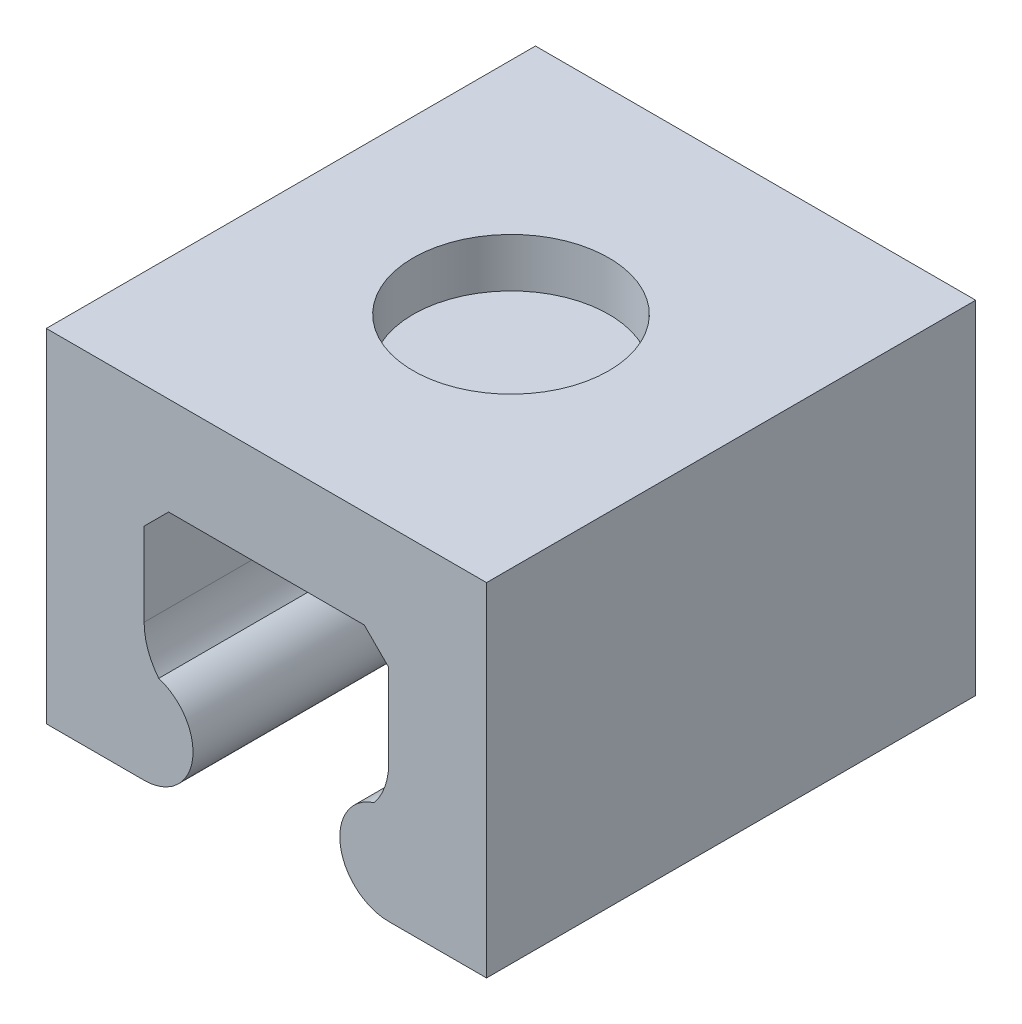
ISO-10303-21;
HEADER;
FILE_DESCRIPTION(('STEP AP214'),'2;1');
FILE_NAME('part.step','',(''),(''),'','','');
FILE_SCHEMA(('AUTOMOTIVE_DESIGN { 1 0 10303 214 1 1 1 1 }'));
ENDSEC;
DATA;
#1=APPLICATION_CONTEXT('core data for automotive mechanical design processes');
#2=APPLICATION_PROTOCOL_DEFINITION('international standard','automotive_design',2000,#1);
#3=PRODUCT_CONTEXT('',#1,'mechanical');
#4=PRODUCT('Part','Part','',(#3));
#5=PRODUCT_RELATED_PRODUCT_CATEGORY('part','',(#4));
#6=PRODUCT_DEFINITION_FORMATION('','',#4);
#7=PRODUCT_DEFINITION_CONTEXT('part definition',#1,'design');
#8=PRODUCT_DEFINITION('design','',#6,#7);
#9=PRODUCT_DEFINITION_SHAPE('','',#8);
#10=(LENGTH_UNIT() NAMED_UNIT(*) SI_UNIT(.MILLI.,.METRE.));
#11=(NAMED_UNIT(*) PLANE_ANGLE_UNIT() SI_UNIT($,.RADIAN.));
#12=(NAMED_UNIT(*) SI_UNIT($,.STERADIAN.) SOLID_ANGLE_UNIT());
#13=UNCERTAINTY_MEASURE_WITH_UNIT(LENGTH_MEASURE(1.E-05),#10,'distance_accuracy_value','');
#14=(GEOMETRIC_REPRESENTATION_CONTEXT(3) GLOBAL_UNCERTAINTY_ASSIGNED_CONTEXT((#13)) GLOBAL_UNIT_ASSIGNED_CONTEXT((#10,
#11,#12)) REPRESENTATION_CONTEXT('',''));
#15=CARTESIAN_POINT('',(0.,0.,0.));
#16=DIRECTION('',(0.,0.,1.));
#17=DIRECTION('',(1.,0.,0.));
#18=AXIS2_PLACEMENT_3D('',#15,#16,#17);
#19=CARTESIAN_POINT('',(4.5,6.,10.));
#20=DIRECTION('',(0.,-1.,0.));
#21=DIRECTION('',(1.,0.,0.));
#22=AXIS2_PLACEMENT_3D('',#19,#20,#21);
#23=PLANE('',#22);
#24=CARTESIAN_POINT('',(0.,6.,5.));
#25=DIRECTION('',(0.,1.,0.));
#26=DIRECTION('',(-1.,0.,0.));
#27=AXIS2_PLACEMENT_3D('',#24,#25,#26);
#28=CIRCLE('',#27,2.);
#29=CARTESIAN_POINT('',(-2.,6.,5.));
#30=VERTEX_POINT('',#29);
#31=EDGE_CURVE('E332',#30,#30,#28,.T.);
#32=ORIENTED_EDGE('',*,*,#31,.F.);
#33=EDGE_LOOP('',(#32));
#34=FACE_BOUND('',#33,.T.);
#35=DIRECTION('',(-1.,0.,0.));
#36=VECTOR('',#35,1.);
#37=CARTESIAN_POINT('',(4.5,6.,0.));
#38=LINE('',#37,#36);
#39=CARTESIAN_POINT('',(4.5,6.,0.));
#40=VERTEX_POINT('',#39);
#41=CARTESIAN_POINT('',(-4.5,6.,0.));
#42=VERTEX_POINT('',#41);
#43=EDGE_CURVE('E176',#40,#42,#38,.T.);
#44=ORIENTED_EDGE('',*,*,#43,.T.);
#45=DIRECTION('',(0.,0.,-1.));
#46=VECTOR('',#45,1.);
#47=CARTESIAN_POINT('',(-4.5,6.,10.));
#48=LINE('',#47,#46);
#49=CARTESIAN_POINT('',(-4.5,6.,10.));
#50=VERTEX_POINT('',#49);
#51=EDGE_CURVE('E11',#50,#42,#48,.T.);
#52=ORIENTED_EDGE('',*,*,#51,.F.);
#53=DIRECTION('',(-1.,0.,0.));
#54=VECTOR('',#53,1.);
#55=CARTESIAN_POINT('',(4.5,6.,10.));
#56=LINE('',#55,#54);
#57=CARTESIAN_POINT('',(4.5,6.,10.));
#58=VERTEX_POINT('',#57);
#59=EDGE_CURVE('E225',#58,#50,#56,.T.);
#60=ORIENTED_EDGE('',*,*,#59,.F.);
#61=DIRECTION('',(0.,0.,-1.));
#62=VECTOR('',#61,1.);
#63=CARTESIAN_POINT('',(4.5,6.,10.));
#64=LINE('',#63,#62);
#65=EDGE_CURVE('E172',#58,#40,#64,.T.);
#66=ORIENTED_EDGE('',*,*,#65,.T.);
#67=EDGE_LOOP('',(#44,#52,#60,#66));
#68=FACE_BOUND('',#67,.T.);
#69=ADVANCED_FACE('F39',(#34,#68),#23,.F.);
#70=CARTESIAN_POINT('',(-4.5,6.,10.));
#71=DIRECTION('',(1.,0.,0.));
#72=DIRECTION('',(0.,1.,0.));
#73=AXIS2_PLACEMENT_3D('',#70,#71,#72);
#74=PLANE('',#73);
#75=DIRECTION('',(0.,-1.,0.));
#76=VECTOR('',#75,1.);
#77=CARTESIAN_POINT('',(-4.5,6.,0.));
#78=LINE('',#77,#76);
#79=CARTESIAN_POINT('',(-4.5,-1.,0.));
#80=VERTEX_POINT('',#79);
#81=EDGE_CURVE('E180',#42,#80,#78,.T.);
#82=ORIENTED_EDGE('',*,*,#81,.T.);
#83=DIRECTION('',(0.,0.,-1.));
#84=VECTOR('',#83,1.);
#85=CARTESIAN_POINT('',(-4.5,-1.,10.));
#86=LINE('',#85,#84);
#87=CARTESIAN_POINT('',(-4.5,-1.,10.));
#88=VERTEX_POINT('',#87);
#89=EDGE_CURVE('E48',#88,#80,#86,.T.);
#90=ORIENTED_EDGE('',*,*,#89,.F.);
#91=DIRECTION('',(0.,-1.,0.));
#92=VECTOR('',#91,1.);
#93=CARTESIAN_POINT('',(-4.5,6.,10.));
#94=LINE('',#93,#92);
#95=EDGE_CURVE('E117',#50,#88,#94,.T.);
#96=ORIENTED_EDGE('',*,*,#95,.F.);
#97=ORIENTED_EDGE('',*,*,#51,.T.);
#98=EDGE_LOOP('',(#82,#90,#96,#97));
#99=FACE_BOUND('',#98,.T.);
#100=ADVANCED_FACE('F323',(#99),#74,.F.);
#101=CARTESIAN_POINT('',(-4.5,-1.,10.));
#102=DIRECTION('',(0.,1.,0.));
#103=DIRECTION('',(-1.,0.,0.));
#104=AXIS2_PLACEMENT_3D('',#101,#102,#103);
#105=PLANE('',#104);
#106=DIRECTION('',(1.,0.,0.));
#107=VECTOR('',#106,1.);
#108=CARTESIAN_POINT('',(-4.5,-1.,0.));
#109=LINE('',#108,#107);
#110=CARTESIAN_POINT('',(-2.5,-1.,0.));
#111=VERTEX_POINT('',#110);
#112=EDGE_CURVE('E184',#80,#111,#109,.T.);
#113=ORIENTED_EDGE('',*,*,#112,.T.);
#114=DIRECTION('',(0.,0.,-1.));
#115=VECTOR('',#114,1.);
#116=CARTESIAN_POINT('',(-2.5,-1.,10.));
#117=LINE('',#116,#115);
#118=CARTESIAN_POINT('',(-2.5,-1.,10.));
#119=VERTEX_POINT('',#118);
#120=EDGE_CURVE('E253',#119,#111,#117,.T.);
#121=ORIENTED_EDGE('',*,*,#120,.F.);
#122=DIRECTION('',(1.,0.,0.));
#123=VECTOR('',#122,1.);
#124=CARTESIAN_POINT('',(-4.5,-1.,10.));
#125=LINE('',#124,#123);
#126=EDGE_CURVE('E263',#88,#119,#125,.T.);
#127=ORIENTED_EDGE('',*,*,#126,.F.);
#128=ORIENTED_EDGE('',*,*,#89,.T.);
#129=EDGE_LOOP('',(#113,#121,#127,#128));
#130=FACE_BOUND('',#129,.T.);
#131=ADVANCED_FACE('F261',(#130),#105,.F.);
#132=CARTESIAN_POINT('',(-2.5,0.,10.));
#133=DIRECTION('',(0.,0.,-1.));
#134=DIRECTION('',(-1.,0.,0.));
#135=AXIS2_PLACEMENT_3D('',#132,#133,#134);
#136=CYLINDRICAL_SURFACE('',#135,1.);
#137=CARTESIAN_POINT('',(-2.5,0.,0.));
#138=DIRECTION('',(0.,0.,1.));
#139=DIRECTION('',(1.,0.,0.));
#140=AXIS2_PLACEMENT_3D('',#137,#138,#139);
#141=CIRCLE('',#140,1.);
#142=CARTESIAN_POINT('',(-2.20143290006781,0.95438864559365,0.));
#143=VERTEX_POINT('',#142);
#144=EDGE_CURVE('E187',#111,#143,#141,.T.);
#145=ORIENTED_EDGE('',*,*,#144,.T.);
#146=DIRECTION('',(0.,0.,-1.));
#147=VECTOR('',#146,1.);
#148=CARTESIAN_POINT('',(-2.20143290006781,0.95438864559365,10.));
#149=LINE('',#148,#147);
#150=CARTESIAN_POINT('',(-2.20143290006781,0.95438864559365,10.));
#151=VERTEX_POINT('',#150);
#152=EDGE_CURVE('E250',#151,#143,#149,.T.);
#153=ORIENTED_EDGE('',*,*,#152,.F.);
#154=CARTESIAN_POINT('',(-2.5,0.,10.));
#155=DIRECTION('',(0.,0.,1.));
#156=DIRECTION('',(1.,0.,0.));
#157=AXIS2_PLACEMENT_3D('',#154,#155,#156);
#158=CIRCLE('',#157,1.);
#159=EDGE_CURVE('E274',#119,#151,#158,.T.);
#160=ORIENTED_EDGE('',*,*,#159,.F.);
#161=ORIENTED_EDGE('',*,*,#120,.T.);
#162=EDGE_LOOP('',(#145,#153,#160,#161));
#163=FACE_BOUND('',#162,.T.);
#164=ADVANCED_FACE('F271',(#163),#136,.T.);
#165=CARTESIAN_POINT('',(-1.15831825530943,1.79820245321149,10.));
#166=DIRECTION('',(0.,0.,-1.));
#167=DIRECTION('',(-1.,0.,0.));
#168=AXIS2_PLACEMENT_3D('',#165,#166,#167);
#169=CYLINDRICAL_SURFACE('',#168,1.34168174469057);
#170=CARTESIAN_POINT('',(-1.15831825530943,1.79820245321149,0.));
#171=DIRECTION('',(0.,0.,1.));
#172=DIRECTION('',(1.,0.,0.));
#173=AXIS2_PLACEMENT_3D('',#170,#171,#172);
#174=CIRCLE('',#173,1.34168174469057);
#175=CARTESIAN_POINT('',(-2.5,1.79820245321149,0.));
#176=VERTEX_POINT('',#175);
#177=EDGE_CURVE('E191',#176,#143,#174,.T.);
#178=ORIENTED_EDGE('',*,*,#177,.F.);
#179=DIRECTION('',(0.,0.,-1.));
#180=VECTOR('',#179,1.);
#181=CARTESIAN_POINT('',(-2.5,1.79820245321149,10.));
#182=LINE('',#181,#180);
#183=CARTESIAN_POINT('',(-2.5,1.79820245321149,10.));
#184=VERTEX_POINT('',#183);
#185=EDGE_CURVE('E247',#184,#176,#182,.T.);
#186=ORIENTED_EDGE('',*,*,#185,.F.);
#187=CARTESIAN_POINT('',(-1.15831825530943,1.79820245321149,10.));
#188=DIRECTION('',(0.,0.,1.));
#189=DIRECTION('',(1.,0.,0.));
#190=AXIS2_PLACEMENT_3D('',#187,#188,#189);
#191=CIRCLE('',#190,1.34168174469057);
#192=EDGE_CURVE('E277',#184,#151,#191,.T.);
#193=ORIENTED_EDGE('',*,*,#192,.T.);
#194=ORIENTED_EDGE('',*,*,#152,.T.);
#195=EDGE_LOOP('',(#178,#186,#193,#194));
#196=FACE_BOUND('',#195,.T.);
#197=ADVANCED_FACE('F434',(#196),#169,.F.);
#198=CARTESIAN_POINT('',(-2.5,3.49999999999997,10.));
#199=DIRECTION('',(1.,0.,0.));
#200=DIRECTION('',(0.,1.,0.));
#201=AXIS2_PLACEMENT_3D('',#198,#199,#200);
#202=PLANE('',#201);
#203=DIRECTION('',(0.,-1.,0.));
#204=VECTOR('',#203,1.);
#205=CARTESIAN_POINT('',(-2.5,3.49999999999997,0.));
#206=LINE('',#205,#204);
#207=CARTESIAN_POINT('',(-2.5,3.49999999999997,0.));
#208=VERTEX_POINT('',#207);
#209=EDGE_CURVE('E195',#208,#176,#206,.T.);
#210=ORIENTED_EDGE('',*,*,#209,.F.);
#211=DIRECTION('',(0.,0.,-1.));
#212=VECTOR('',#211,1.);
#213=CARTESIAN_POINT('',(-2.5,3.49999999999997,10.));
#214=LINE('',#213,#212);
#215=CARTESIAN_POINT('',(-2.5,3.49999999999997,10.));
#216=VERTEX_POINT('',#215);
#217=EDGE_CURVE('E244',#216,#208,#214,.T.);
#218=ORIENTED_EDGE('',*,*,#217,.F.);
#219=DIRECTION('',(0.,-1.,0.));
#220=VECTOR('',#219,1.);
#221=CARTESIAN_POINT('',(-2.5,3.49999999999997,10.));
#222=LINE('',#221,#220);
#223=EDGE_CURVE('E281',#216,#184,#222,.T.);
#224=ORIENTED_EDGE('',*,*,#223,.T.);
#225=ORIENTED_EDGE('',*,*,#185,.T.);
#226=EDGE_LOOP('',(#210,#218,#224,#225));
#227=FACE_BOUND('',#226,.T.);
#228=ADVANCED_FACE('F424',(#227),#202,.T.);
#229=CARTESIAN_POINT('',(-2.,4.,10.));
#230=DIRECTION('',(0.707106781186567,-0.707106781186528,0.));
#231=DIRECTION('',(0.707106781186528,0.707106781186567,0.));
#232=AXIS2_PLACEMENT_3D('',#229,#230,#231);
#233=PLANE('',#232);
#234=DIRECTION('',(-0.707106781186528,-0.707106781186567,0.));
#235=VECTOR('',#234,1.);
#236=CARTESIAN_POINT('',(-2.,4.,0.));
#237=LINE('',#236,#235);
#238=CARTESIAN_POINT('',(-2.,4.,0.));
#239=VERTEX_POINT('',#238);
#240=EDGE_CURVE('E199',#239,#208,#237,.T.);
#241=ORIENTED_EDGE('',*,*,#240,.F.);
#242=DIRECTION('',(0.,0.,-1.));
#243=VECTOR('',#242,1.);
#244=CARTESIAN_POINT('',(-2.,4.,10.));
#245=LINE('',#244,#243);
#246=CARTESIAN_POINT('',(-2.,4.,10.));
#247=VERTEX_POINT('',#246);
#248=EDGE_CURVE('E241',#247,#239,#245,.T.);
#249=ORIENTED_EDGE('',*,*,#248,.F.);
#250=DIRECTION('',(-0.707106781186528,-0.707106781186567,0.));
#251=VECTOR('',#250,1.);
#252=CARTESIAN_POINT('',(-2.,4.,10.));
#253=LINE('',#252,#251);
#254=EDGE_CURVE('E289',#247,#216,#253,.T.);
#255=ORIENTED_EDGE('',*,*,#254,.T.);
#256=ORIENTED_EDGE('',*,*,#217,.T.);
#257=EDGE_LOOP('',(#241,#249,#255,#256));
#258=FACE_BOUND('',#257,.T.);
#259=ADVANCED_FACE('F414',(#258),#233,.T.);
#260=CARTESIAN_POINT('',(1.99999999999997,4.,10.));
#261=DIRECTION('',(0.,-1.,0.));
#262=DIRECTION('',(0.,0.,-1.));
#263=AXIS2_PLACEMENT_3D('',#260,#261,#262);
#264=PLANE('',#263);
#265=DIRECTION('',(-1.,0.,0.));
#266=VECTOR('',#265,1.);
#267=CARTESIAN_POINT('',(1.99999999999997,4.,0.));
#268=LINE('',#267,#266);
#269=CARTESIAN_POINT('',(1.99999999999997,4.,0.));
#270=VERTEX_POINT('',#269);
#271=EDGE_CURVE('E203',#270,#239,#268,.T.);
#272=ORIENTED_EDGE('',*,*,#271,.F.);
#273=DIRECTION('',(0.,0.,-1.));
#274=VECTOR('',#273,1.);
#275=CARTESIAN_POINT('',(1.99999999999997,4.,10.));
#276=LINE('',#275,#274);
#277=CARTESIAN_POINT('',(1.99999999999997,4.,10.));
#278=VERTEX_POINT('',#277);
#279=EDGE_CURVE('E238',#278,#270,#276,.T.);
#280=ORIENTED_EDGE('',*,*,#279,.F.);
#281=DIRECTION('',(-1.,0.,0.));
#282=VECTOR('',#281,1.);
#283=CARTESIAN_POINT('',(1.99999999999997,4.,10.));
#284=LINE('',#283,#282);
#285=EDGE_CURVE('E293',#278,#247,#284,.T.);
#286=ORIENTED_EDGE('',*,*,#285,.T.);
#287=ORIENTED_EDGE('',*,*,#248,.T.);
#288=EDGE_LOOP('',(#272,#280,#286,#287));
#289=FACE_BOUND('',#288,.T.);
#290=ADVANCED_FACE('F404',(#289),#264,.T.);
#291=CARTESIAN_POINT('',(2.5,3.49999999999997,10.));
#292=DIRECTION('',(-0.707106781186548,-0.707106781186548,0.));
#293=DIRECTION('',(0.707106781186548,-0.707106781186548,0.));
#294=AXIS2_PLACEMENT_3D('',#291,#292,#293);
#295=PLANE('',#294);
#296=DIRECTION('',(-0.707106781186548,0.707106781186548,0.));
#297=VECTOR('',#296,1.);
#298=CARTESIAN_POINT('',(2.5,3.49999999999997,0.));
#299=LINE('',#298,#297);
#300=CARTESIAN_POINT('',(2.5,3.49999999999997,0.));
#301=VERTEX_POINT('',#300);
#302=EDGE_CURVE('E207',#301,#270,#299,.T.);
#303=ORIENTED_EDGE('',*,*,#302,.F.);
#304=DIRECTION('',(0.,0.,-1.));
#305=VECTOR('',#304,1.);
#306=CARTESIAN_POINT('',(2.5,3.49999999999997,10.));
#307=LINE('',#306,#305);
#308=CARTESIAN_POINT('',(2.5,3.49999999999997,10.));
#309=VERTEX_POINT('',#308);
#310=EDGE_CURVE('E235',#309,#301,#307,.T.);
#311=ORIENTED_EDGE('',*,*,#310,.F.);
#312=DIRECTION('',(-0.707106781186548,0.707106781186548,0.));
#313=VECTOR('',#312,1.);
#314=CARTESIAN_POINT('',(2.5,3.49999999999997,10.));
#315=LINE('',#314,#313);
#316=EDGE_CURVE('E297',#309,#278,#315,.T.);
#317=ORIENTED_EDGE('',*,*,#316,.T.);
#318=ORIENTED_EDGE('',*,*,#279,.T.);
#319=EDGE_LOOP('',(#303,#311,#317,#318));
#320=FACE_BOUND('',#319,.T.);
#321=ADVANCED_FACE('F394',(#320),#295,.T.);
#322=CARTESIAN_POINT('',(2.5,1.7982024532115,10.));
#323=DIRECTION('',(-1.,0.,0.));
#324=DIRECTION('',(0.,-1.,0.));
#325=AXIS2_PLACEMENT_3D('',#322,#323,#324);
#326=PLANE('',#325);
#327=DIRECTION('',(0.,1.,0.));
#328=VECTOR('',#327,1.);
#329=CARTESIAN_POINT('',(2.5,1.7982024532115,0.));
#330=LINE('',#329,#328);
#331=CARTESIAN_POINT('',(2.5,1.7982024532115,0.));
#332=VERTEX_POINT('',#331);
#333=EDGE_CURVE('E211',#332,#301,#330,.T.);
#334=ORIENTED_EDGE('',*,*,#333,.F.);
#335=DIRECTION('',(0.,0.,-1.));
#336=VECTOR('',#335,1.);
#337=CARTESIAN_POINT('',(2.5,1.7982024532115,10.));
#338=LINE('',#337,#336);
#339=CARTESIAN_POINT('',(2.5,1.7982024532115,10.));
#340=VERTEX_POINT('',#339);
#341=EDGE_CURVE('E232',#340,#332,#338,.T.);
#342=ORIENTED_EDGE('',*,*,#341,.F.);
#343=DIRECTION('',(0.,1.,0.));
#344=VECTOR('',#343,1.);
#345=CARTESIAN_POINT('',(2.5,1.7982024532115,10.));
#346=LINE('',#345,#344);
#347=EDGE_CURVE('E301',#340,#309,#346,.T.);
#348=ORIENTED_EDGE('',*,*,#347,.T.);
#349=ORIENTED_EDGE('',*,*,#310,.T.);
#350=EDGE_LOOP('',(#334,#342,#348,#349));
#351=FACE_BOUND('',#350,.T.);
#352=ADVANCED_FACE('F385',(#351),#326,.T.);
#353=CARTESIAN_POINT('',(1.15831825530943,1.79820245321149,10.));
#354=DIRECTION('',(0.,0.,-1.));
#355=DIRECTION('',(-1.,0.,0.));
#356=AXIS2_PLACEMENT_3D('',#353,#354,#355);
#357=CYLINDRICAL_SURFACE('',#356,1.34168174469057);
#358=CARTESIAN_POINT('',(1.15831825530943,1.79820245321149,0.));
#359=DIRECTION('',(0.,0.,1.));
#360=DIRECTION('',(1.,0.,0.));
#361=AXIS2_PLACEMENT_3D('',#358,#359,#360);
#362=CIRCLE('',#361,1.34168174469057);
#363=CARTESIAN_POINT('',(2.20143290006781,0.954388645593651,0.));
#364=VERTEX_POINT('',#363);
#365=EDGE_CURVE('E215',#364,#332,#362,.T.);
#366=ORIENTED_EDGE('',*,*,#365,.F.);
#367=DIRECTION('',(0.,0.,-1.));
#368=VECTOR('',#367,1.);
#369=CARTESIAN_POINT('',(2.20143290006781,0.954388645593651,10.));
#370=LINE('',#369,#368);
#371=CARTESIAN_POINT('',(2.20143290006781,0.954388645593651,10.));
#372=VERTEX_POINT('',#371);
#373=EDGE_CURVE('E165',#372,#364,#370,.T.);
#374=ORIENTED_EDGE('',*,*,#373,.F.);
#375=CARTESIAN_POINT('',(1.15831825530943,1.79820245321149,10.));
#376=DIRECTION('',(0.,0.,1.));
#377=DIRECTION('',(1.,0.,0.));
#378=AXIS2_PLACEMENT_3D('',#375,#376,#377);
#379=CIRCLE('',#378,1.34168174469057);
#380=EDGE_CURVE('E156',#372,#340,#379,.T.);
#381=ORIENTED_EDGE('',*,*,#380,.T.);
#382=ORIENTED_EDGE('',*,*,#341,.T.);
#383=EDGE_LOOP('',(#366,#374,#381,#382));
#384=FACE_BOUND('',#383,.T.);
#385=ADVANCED_FACE('F307',(#384),#357,.F.);
#386=CARTESIAN_POINT('',(2.5,0.,10.));
#387=DIRECTION('',(0.,0.,-1.));
#388=DIRECTION('',(-1.,0.,0.));
#389=AXIS2_PLACEMENT_3D('',#386,#387,#388);
#390=CYLINDRICAL_SURFACE('',#389,1.);
#391=CARTESIAN_POINT('',(2.5,0.,0.));
#392=DIRECTION('',(0.,0.,1.));
#393=DIRECTION('',(1.,0.,0.));
#394=AXIS2_PLACEMENT_3D('',#391,#392,#393);
#395=CIRCLE('',#394,1.);
#396=CARTESIAN_POINT('',(2.5,-1.,0.));
#397=VERTEX_POINT('',#396);
#398=EDGE_CURVE('E163',#364,#397,#395,.T.);
#399=ORIENTED_EDGE('',*,*,#398,.T.);
#400=DIRECTION('',(0.,0.,-1.));
#401=VECTOR('',#400,1.);
#402=CARTESIAN_POINT('',(2.5,-1.,10.));
#403=LINE('',#402,#401);
#404=CARTESIAN_POINT('',(2.5,-1.,10.));
#405=VERTEX_POINT('',#404);
#406=EDGE_CURVE('E160',#405,#397,#403,.T.);
#407=ORIENTED_EDGE('',*,*,#406,.F.);
#408=CARTESIAN_POINT('',(2.5,0.,10.));
#409=DIRECTION('',(0.,0.,1.));
#410=DIRECTION('',(1.,0.,0.));
#411=AXIS2_PLACEMENT_3D('',#408,#409,#410);
#412=CIRCLE('',#411,1.);
#413=EDGE_CURVE('E149',#372,#405,#412,.T.);
#414=ORIENTED_EDGE('',*,*,#413,.F.);
#415=ORIENTED_EDGE('',*,*,#373,.T.);
#416=EDGE_LOOP('',(#399,#407,#414,#415));
#417=FACE_BOUND('',#416,.T.);
#418=ADVANCED_FACE('F161',(#417),#390,.T.);
#419=CARTESIAN_POINT('',(2.5,-1.,10.));
#420=DIRECTION('',(0.,1.,0.));
#421=DIRECTION('',(-1.,0.,0.));
#422=AXIS2_PLACEMENT_3D('',#419,#420,#421);
#423=PLANE('',#422);
#424=DIRECTION('',(1.,0.,0.));
#425=VECTOR('',#424,1.);
#426=CARTESIAN_POINT('',(2.5,-1.,0.));
#427=LINE('',#426,#425);
#428=CARTESIAN_POINT('',(4.5,-1.,0.));
#429=VERTEX_POINT('',#428);
#430=EDGE_CURVE('E103',#397,#429,#427,.T.);
#431=ORIENTED_EDGE('',*,*,#430,.T.);
#432=DIRECTION('',(0.,0.,-1.));
#433=VECTOR('',#432,1.);
#434=CARTESIAN_POINT('',(4.5,-1.,10.));
#435=LINE('',#434,#433);
#436=CARTESIAN_POINT('',(4.5,-1.,10.));
#437=VERTEX_POINT('',#436);
#438=EDGE_CURVE('E166',#437,#429,#435,.T.);
#439=ORIENTED_EDGE('',*,*,#438,.F.);
#440=DIRECTION('',(1.,0.,0.));
#441=VECTOR('',#440,1.);
#442=CARTESIAN_POINT('',(2.5,-1.,10.));
#443=LINE('',#442,#441);
#444=EDGE_CURVE('E153',#405,#437,#443,.T.);
#445=ORIENTED_EDGE('',*,*,#444,.F.);
#446=ORIENTED_EDGE('',*,*,#406,.T.);
#447=EDGE_LOOP('',(#431,#439,#445,#446));
#448=FACE_BOUND('',#447,.T.);
#449=ADVANCED_FACE('F168',(#448),#423,.F.);
#450=CARTESIAN_POINT('',(4.5,-1.,10.));
#451=DIRECTION('',(-1.,0.,0.));
#452=DIRECTION('',(0.,0.,1.));
#453=AXIS2_PLACEMENT_3D('',#450,#451,#452);
#454=PLANE('',#453);
#455=DIRECTION('',(0.,1.,0.));
#456=VECTOR('',#455,1.);
#457=CARTESIAN_POINT('',(4.5,-1.,0.));
#458=LINE('',#457,#456);
#459=EDGE_CURVE('E109',#429,#40,#458,.T.);
#460=ORIENTED_EDGE('',*,*,#459,.T.);
#461=ORIENTED_EDGE('',*,*,#65,.F.);
#462=DIRECTION('',(0.,1.,0.));
#463=VECTOR('',#462,1.);
#464=CARTESIAN_POINT('',(4.5,-1.,10.));
#465=LINE('',#464,#463);
#466=EDGE_CURVE('E56',#437,#58,#465,.T.);
#467=ORIENTED_EDGE('',*,*,#466,.F.);
#468=ORIENTED_EDGE('',*,*,#438,.T.);
#469=EDGE_LOOP('',(#460,#461,#467,#468));
#470=FACE_BOUND('',#469,.T.);
#471=ADVANCED_FACE('F312',(#470),#454,.F.);
#472=CARTESIAN_POINT('',(-2.5,0.,10.));
#473=DIRECTION('',(0.,0.,1.));
#474=DIRECTION('',(1.,0.,0.));
#475=AXIS2_PLACEMENT_3D('',#472,#473,#474);
#476=PLANE('',#475);
#477=ORIENTED_EDGE('',*,*,#59,.T.);
#478=ORIENTED_EDGE('',*,*,#95,.T.);
#479=ORIENTED_EDGE('',*,*,#126,.T.);
#480=ORIENTED_EDGE('',*,*,#159,.T.);
#481=ORIENTED_EDGE('',*,*,#192,.F.);
#482=ORIENTED_EDGE('',*,*,#223,.F.);
#483=ORIENTED_EDGE('',*,*,#254,.F.);
#484=ORIENTED_EDGE('',*,*,#285,.F.);
#485=ORIENTED_EDGE('',*,*,#316,.F.);
#486=ORIENTED_EDGE('',*,*,#347,.F.);
#487=ORIENTED_EDGE('',*,*,#380,.F.);
#488=ORIENTED_EDGE('',*,*,#413,.T.);
#489=ORIENTED_EDGE('',*,*,#444,.T.);
#490=ORIENTED_EDGE('',*,*,#466,.T.);
#491=EDGE_LOOP('',(#477,#478,#479,#480,#481,#482,#483,#484,#485,#486,#487,#488,#489,#490));
#492=FACE_BOUND('',#491,.T.);
#493=ADVANCED_FACE('F151',(#492),#476,.T.);
#494=CARTESIAN_POINT('',(-2.5,0.,0.));
#495=DIRECTION('',(0.,0.,1.));
#496=DIRECTION('',(1.,0.,0.));
#497=AXIS2_PLACEMENT_3D('',#494,#495,#496);
#498=PLANE('',#497);
#499=ORIENTED_EDGE('',*,*,#43,.F.);
#500=ORIENTED_EDGE('',*,*,#459,.F.);
#501=ORIENTED_EDGE('',*,*,#430,.F.);
#502=ORIENTED_EDGE('',*,*,#398,.F.);
#503=ORIENTED_EDGE('',*,*,#365,.T.);
#504=ORIENTED_EDGE('',*,*,#333,.T.);
#505=ORIENTED_EDGE('',*,*,#302,.T.);
#506=ORIENTED_EDGE('',*,*,#271,.T.);
#507=ORIENTED_EDGE('',*,*,#240,.T.);
#508=ORIENTED_EDGE('',*,*,#209,.T.);
#509=ORIENTED_EDGE('',*,*,#177,.T.);
#510=ORIENTED_EDGE('',*,*,#144,.F.);
#511=ORIENTED_EDGE('',*,*,#112,.F.);
#512=ORIENTED_EDGE('',*,*,#81,.F.);
#513=EDGE_LOOP('',(#499,#500,#501,#502,#503,#504,#505,#506,#507,#508,#509,#510,#511,#512));
#514=FACE_BOUND('',#513,.T.);
#515=ADVANCED_FACE('F267',(#514),#498,.F.);
#516=CARTESIAN_POINT('',(0.,5.,5.));
#517=DIRECTION('',(0.,1.,0.));
#518=DIRECTION('',(-1.,0.,0.));
#519=AXIS2_PLACEMENT_3D('',#516,#517,#518);
#520=CYLINDRICAL_SURFACE('',#519,2.);
#521=CARTESIAN_POINT('',(0.,5.,5.));
#522=DIRECTION('',(0.,1.,0.));
#523=DIRECTION('',(-1.,0.,0.));
#524=AXIS2_PLACEMENT_3D('',#521,#522,#523);
#525=CIRCLE('',#524,2.);
#526=CARTESIAN_POINT('',(-2.,5.,5.));
#527=VERTEX_POINT('',#526);
#528=EDGE_CURVE('E181',#527,#527,#525,.T.);
#529=ORIENTED_EDGE('',*,*,#528,.F.);
#530=EDGE_LOOP('',(#529));
#531=FACE_BOUND('',#530,.T.);
#532=ORIENTED_EDGE('',*,*,#31,.T.);
#533=EDGE_LOOP('',(#532));
#534=FACE_BOUND('',#533,.T.);
#535=ADVANCED_FACE('F346',(#531,#534),#520,.F.);
#536=CARTESIAN_POINT('',(0.,5.,5.));
#537=DIRECTION('',(0.,1.,0.));
#538=DIRECTION('',(-1.,0.,0.));
#539=AXIS2_PLACEMENT_3D('',#536,#537,#538);
#540=PLANE('',#539);
#541=ORIENTED_EDGE('',*,*,#528,.T.);
#542=EDGE_LOOP('',(#541));
#543=FACE_BOUND('',#542,.T.);
#544=ADVANCED_FACE('F344',(#543),#540,.T.);
#545=CLOSED_SHELL('',(#69,#100,#131,#164,#197,#228,#259,#290,#321,#352,#385,#418,#449,#471,#493,
#515,#535,#544));
#546=MANIFOLD_SOLID_BREP('B2',#545);
#547=ADVANCED_BREP_SHAPE_REPRESENTATION('',(#18,#546),#14);
#548=SHAPE_DEFINITION_REPRESENTATION(#9,#547);
ENDSEC;
END-ISO-10303-21;
